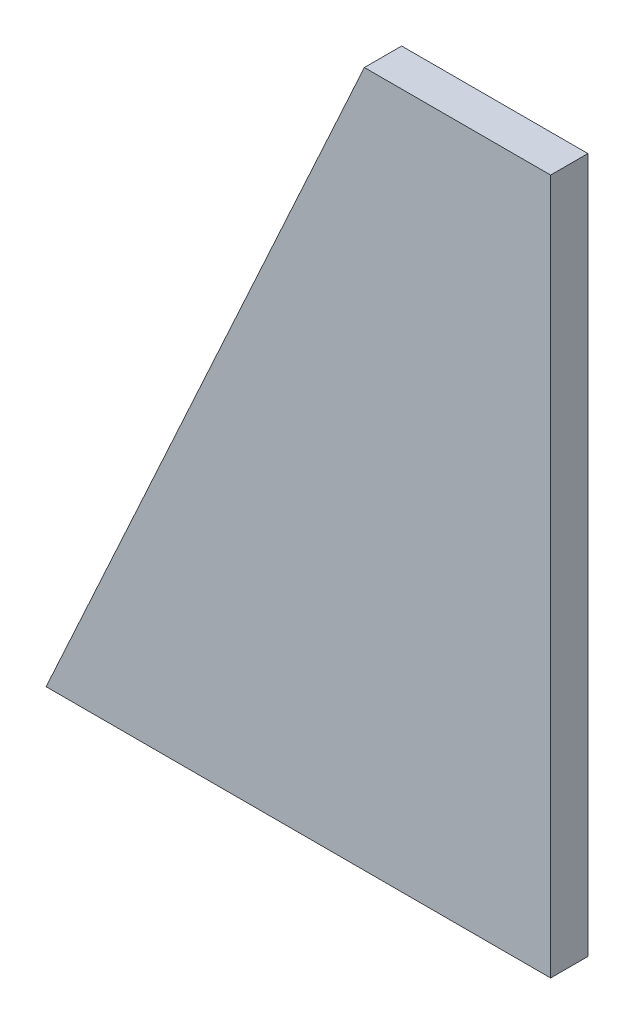
ISO-10303-21;
HEADER;
FILE_DESCRIPTION(('STEP AP214'),'2;1');
FILE_NAME('part.step','',(''),(''),'','','');
FILE_SCHEMA(('AUTOMOTIVE_DESIGN { 1 0 10303 214 1 1 1 1 }'));
ENDSEC;
DATA;
#1=APPLICATION_CONTEXT('core data for automotive mechanical design processes');
#2=APPLICATION_PROTOCOL_DEFINITION('international standard','automotive_design',2000,#1);
#3=PRODUCT_CONTEXT('',#1,'mechanical');
#4=PRODUCT('Part','Part','',(#3));
#5=PRODUCT_RELATED_PRODUCT_CATEGORY('part','',(#4));
#6=PRODUCT_DEFINITION_FORMATION('','',#4);
#7=PRODUCT_DEFINITION_CONTEXT('part definition',#1,'design');
#8=PRODUCT_DEFINITION('design','',#6,#7);
#9=PRODUCT_DEFINITION_SHAPE('','',#8);
#10=(LENGTH_UNIT() NAMED_UNIT(*) SI_UNIT(.MILLI.,.METRE.));
#11=(NAMED_UNIT(*) PLANE_ANGLE_UNIT() SI_UNIT($,.RADIAN.));
#12=(NAMED_UNIT(*) SI_UNIT($,.STERADIAN.) SOLID_ANGLE_UNIT());
#13=UNCERTAINTY_MEASURE_WITH_UNIT(LENGTH_MEASURE(1.E-05),#10,'distance_accuracy_value','');
#14=(GEOMETRIC_REPRESENTATION_CONTEXT(3) GLOBAL_UNCERTAINTY_ASSIGNED_CONTEXT((#13)) GLOBAL_UNIT_ASSIGNED_CONTEXT((#10,
#11,#12)) REPRESENTATION_CONTEXT('',''));
#15=CARTESIAN_POINT('',(0.,0.,0.));
#16=DIRECTION('',(0.,0.,1.));
#17=DIRECTION('',(1.,0.,0.));
#18=AXIS2_PLACEMENT_3D('',#15,#16,#17);
#19=CARTESIAN_POINT('',(-40.63,0.,3.));
#20=DIRECTION('',(0.,1.,0.));
#21=DIRECTION('',(-1.,0.,0.));
#22=AXIS2_PLACEMENT_3D('',#19,#20,#21);
#23=PLANE('',#22);
#24=DIRECTION('',(1.,0.,0.));
#25=VECTOR('',#24,1.);
#26=CARTESIAN_POINT('',(-40.63,0.,0.));
#27=LINE('',#26,#25);
#28=CARTESIAN_POINT('',(-40.63,0.,0.));
#29=VERTEX_POINT('',#28);
#30=CARTESIAN_POINT('',(0.,0.,0.));
#31=VERTEX_POINT('',#30);
#32=EDGE_CURVE('E99',#29,#31,#27,.T.);
#33=ORIENTED_EDGE('',*,*,#32,.T.);
#34=DIRECTION('',(0.,0.,-1.));
#35=VECTOR('',#34,1.);
#36=CARTESIAN_POINT('',(0.,0.,3.));
#37=LINE('',#36,#35);
#38=CARTESIAN_POINT('',(0.,0.,3.));
#39=VERTEX_POINT('',#38);
#40=EDGE_CURVE('E11',#39,#31,#37,.T.);
#41=ORIENTED_EDGE('',*,*,#40,.F.);
#42=DIRECTION('',(1.,0.,0.));
#43=VECTOR('',#42,1.);
#44=CARTESIAN_POINT('',(-40.63,0.,3.));
#45=LINE('',#44,#43);
#46=CARTESIAN_POINT('',(-40.63,0.,3.));
#47=VERTEX_POINT('',#46);
#48=EDGE_CURVE('E87',#47,#39,#45,.T.);
#49=ORIENTED_EDGE('',*,*,#48,.F.);
#50=DIRECTION('',(0.,0.,-1.));
#51=VECTOR('',#50,1.);
#52=CARTESIAN_POINT('',(-40.63,0.,3.));
#53=LINE('',#52,#51);
#54=EDGE_CURVE('E95',#47,#29,#53,.T.);
#55=ORIENTED_EDGE('',*,*,#54,.T.);
#56=EDGE_LOOP('',(#33,#41,#49,#55));
#57=FACE_BOUND('',#56,.T.);
#58=ADVANCED_FACE('F36',(#57),#23,.F.);
#59=CARTESIAN_POINT('',(0.,0.,3.));
#60=DIRECTION('',(-1.,0.,0.));
#61=DIRECTION('',(0.,-1.,0.));
#62=AXIS2_PLACEMENT_3D('',#59,#60,#61);
#63=PLANE('',#62);
#64=DIRECTION('',(0.,1.,0.));
#65=VECTOR('',#64,1.);
#66=CARTESIAN_POINT('',(0.,0.,0.));
#67=LINE('',#66,#65);
#68=CARTESIAN_POINT('',(0.,56.,0.));
#69=VERTEX_POINT('',#68);
#70=EDGE_CURVE('E91',#31,#69,#67,.T.);
#71=ORIENTED_EDGE('',*,*,#70,.T.);
#72=DIRECTION('',(0.,0.,-1.));
#73=VECTOR('',#72,1.);
#74=CARTESIAN_POINT('',(0.,56.,3.));
#75=LINE('',#74,#73);
#76=CARTESIAN_POINT('',(0.,56.,3.));
#77=VERTEX_POINT('',#76);
#78=EDGE_CURVE('E44',#77,#69,#75,.T.);
#79=ORIENTED_EDGE('',*,*,#78,.F.);
#80=DIRECTION('',(0.,1.,0.));
#81=VECTOR('',#80,1.);
#82=CARTESIAN_POINT('',(0.,0.,3.));
#83=LINE('',#82,#81);
#84=EDGE_CURVE('E82',#39,#77,#83,.T.);
#85=ORIENTED_EDGE('',*,*,#84,.F.);
#86=ORIENTED_EDGE('',*,*,#40,.T.);
#87=EDGE_LOOP('',(#71,#79,#85,#86));
#88=FACE_BOUND('',#87,.T.);
#89=ADVANCED_FACE('F90',(#88),#63,.F.);
#90=CARTESIAN_POINT('',(0.,56.,3.));
#91=DIRECTION('',(0.,-1.,0.));
#92=DIRECTION('',(1.,0.,0.));
#93=AXIS2_PLACEMENT_3D('',#90,#91,#92);
#94=PLANE('',#93);
#95=DIRECTION('',(-1.,0.,0.));
#96=VECTOR('',#95,1.);
#97=CARTESIAN_POINT('',(0.,56.,0.));
#98=LINE('',#97,#96);
#99=CARTESIAN_POINT('',(-15.,56.,0.));
#100=VERTEX_POINT('',#99);
#101=EDGE_CURVE('E69',#69,#100,#98,.T.);
#102=ORIENTED_EDGE('',*,*,#101,.T.);
#103=DIRECTION('',(0.,0.,-1.));
#104=VECTOR('',#103,1.);
#105=CARTESIAN_POINT('',(-15.,56.,3.));
#106=LINE('',#105,#104);
#107=CARTESIAN_POINT('',(-15.,56.,3.));
#108=VERTEX_POINT('',#107);
#109=EDGE_CURVE('E92',#108,#100,#106,.T.);
#110=ORIENTED_EDGE('',*,*,#109,.F.);
#111=DIRECTION('',(-1.,0.,0.));
#112=VECTOR('',#111,1.);
#113=CARTESIAN_POINT('',(0.,56.,3.));
#114=LINE('',#113,#112);
#115=EDGE_CURVE('E85',#77,#108,#114,.T.);
#116=ORIENTED_EDGE('',*,*,#115,.F.);
#117=ORIENTED_EDGE('',*,*,#78,.T.);
#118=EDGE_LOOP('',(#102,#110,#116,#117));
#119=FACE_BOUND('',#118,.T.);
#120=ADVANCED_FACE('F93',(#119),#94,.F.);
#121=CARTESIAN_POINT('',(-15.,56.,3.));
#122=DIRECTION('',(0.909290195208164,-0.416162637556879,0.));
#123=DIRECTION('',(0.416162637556879,0.909290195208164,0.));
#124=AXIS2_PLACEMENT_3D('',#121,#122,#123);
#125=PLANE('',#124);
#126=DIRECTION('',(-0.416162637556879,-0.909290195208165,0.));
#127=VECTOR('',#126,1.);
#128=CARTESIAN_POINT('',(-15.,56.,0.));
#129=LINE('',#128,#127);
#130=EDGE_CURVE('E75',#100,#29,#129,.T.);
#131=ORIENTED_EDGE('',*,*,#130,.T.);
#132=ORIENTED_EDGE('',*,*,#54,.F.);
#133=DIRECTION('',(-0.416162637556879,-0.909290195208165,0.));
#134=VECTOR('',#133,1.);
#135=CARTESIAN_POINT('',(-15.,56.,3.));
#136=LINE('',#135,#134);
#137=EDGE_CURVE('E52',#108,#47,#136,.T.);
#138=ORIENTED_EDGE('',*,*,#137,.F.);
#139=ORIENTED_EDGE('',*,*,#109,.T.);
#140=EDGE_LOOP('',(#131,#132,#138,#139));
#141=FACE_BOUND('',#140,.T.);
#142=ADVANCED_FACE('F106',(#141),#125,.F.);
#143=CARTESIAN_POINT('',(0.,0.,3.));
#144=DIRECTION('',(0.,0.,1.));
#145=DIRECTION('',(1.,0.,0.));
#146=AXIS2_PLACEMENT_3D('',#143,#144,#145);
#147=PLANE('',#146);
#148=ORIENTED_EDGE('',*,*,#48,.T.);
#149=ORIENTED_EDGE('',*,*,#84,.T.);
#150=ORIENTED_EDGE('',*,*,#115,.T.);
#151=ORIENTED_EDGE('',*,*,#137,.T.);
#152=EDGE_LOOP('',(#148,#149,#150,#151));
#153=FACE_BOUND('',#152,.T.);
#154=ADVANCED_FACE('F83',(#153),#147,.T.);
#155=CARTESIAN_POINT('',(0.,0.,0.));
#156=DIRECTION('',(0.,0.,1.));
#157=DIRECTION('',(1.,0.,0.));
#158=AXIS2_PLACEMENT_3D('',#155,#156,#157);
#159=PLANE('',#158);
#160=ORIENTED_EDGE('',*,*,#32,.F.);
#161=ORIENTED_EDGE('',*,*,#130,.F.);
#162=ORIENTED_EDGE('',*,*,#101,.F.);
#163=ORIENTED_EDGE('',*,*,#70,.F.);
#164=EDGE_LOOP('',(#160,#161,#162,#163));
#165=FACE_BOUND('',#164,.T.);
#166=ADVANCED_FACE('F109',(#165),#159,.F.);
#167=CLOSED_SHELL('',(#58,#89,#120,#142,#154,#166));
#168=MANIFOLD_SOLID_BREP('B2',#167);
#169=ADVANCED_BREP_SHAPE_REPRESENTATION('',(#18,#168),#14);
#170=SHAPE_DEFINITION_REPRESENTATION(#9,#169);
ENDSEC;
END-ISO-10303-21;
